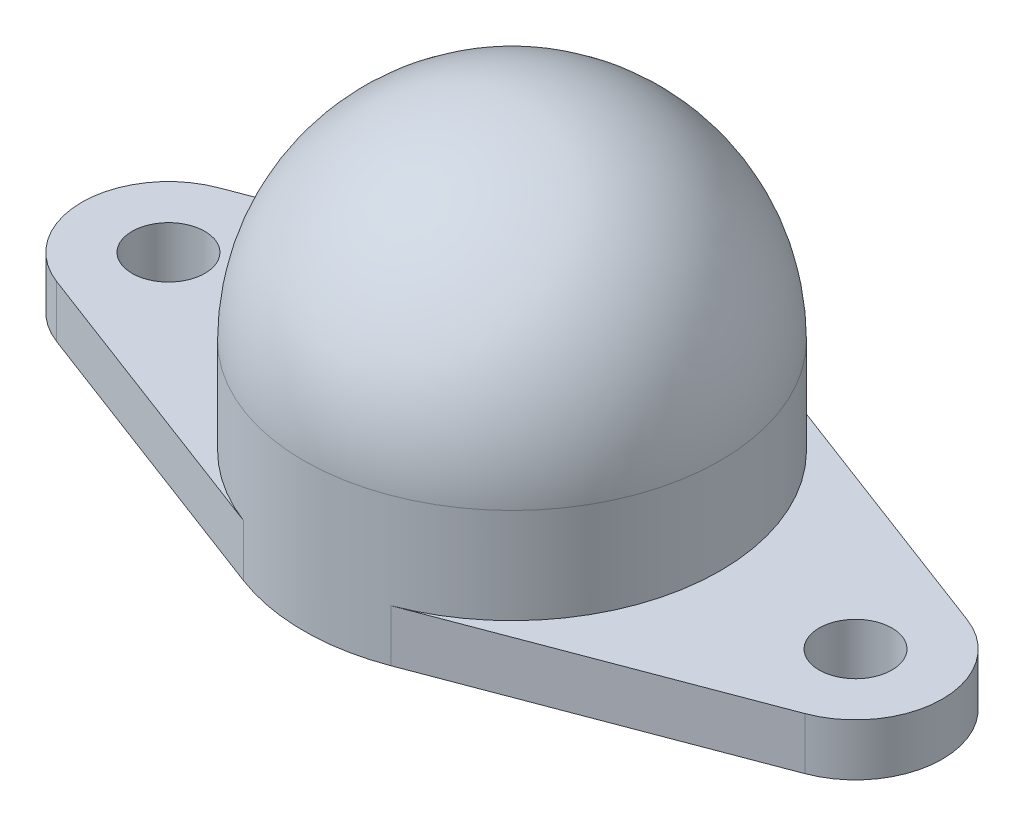
ISO-10303-21;
HEADER;
FILE_DESCRIPTION(('STEP AP214'),'2;1');
FILE_NAME('part.step','',(''),(''),'','','');
FILE_SCHEMA(('AUTOMOTIVE_DESIGN { 1 0 10303 214 1 1 1 1 }'));
ENDSEC;
DATA;
#1=APPLICATION_CONTEXT('core data for automotive mechanical design processes');
#2=APPLICATION_PROTOCOL_DEFINITION('international standard','automotive_design',2000,#1);
#3=PRODUCT_CONTEXT('',#1,'mechanical');
#4=PRODUCT('Part','Part','',(#3));
#5=PRODUCT_RELATED_PRODUCT_CATEGORY('part','',(#4));
#6=PRODUCT_DEFINITION_FORMATION('','',#4);
#7=PRODUCT_DEFINITION_CONTEXT('part definition',#1,'design');
#8=PRODUCT_DEFINITION('design','',#6,#7);
#9=PRODUCT_DEFINITION_SHAPE('','',#8);
#10=(LENGTH_UNIT() NAMED_UNIT(*) SI_UNIT(.MILLI.,.METRE.));
#11=(NAMED_UNIT(*) PLANE_ANGLE_UNIT() SI_UNIT($,.RADIAN.));
#12=(NAMED_UNIT(*) SI_UNIT($,.STERADIAN.) SOLID_ANGLE_UNIT());
#13=UNCERTAINTY_MEASURE_WITH_UNIT(LENGTH_MEASURE(1.E-05),#10,'distance_accuracy_value','');
#14=(GEOMETRIC_REPRESENTATION_CONTEXT(3) GLOBAL_UNCERTAINTY_ASSIGNED_CONTEXT((#13)) GLOBAL_UNIT_ASSIGNED_CONTEXT((#10,
#11,#12)) REPRESENTATION_CONTEXT('',''));
#15=CARTESIAN_POINT('',(0.,0.,0.));
#16=DIRECTION('',(0.,0.,1.));
#17=DIRECTION('',(1.,0.,0.));
#18=AXIS2_PLACEMENT_3D('',#15,#16,#17);
#19=CARTESIAN_POINT('',(0.,3.,0.));
#20=DIRECTION('',(0.,1.,0.));
#21=DIRECTION('',(0.,0.,1.));
#22=AXIS2_PLACEMENT_3D('',#19,#20,#21);
#23=PLANE('',#22);
#24=CARTESIAN_POINT('',(0.,3.,0.));
#25=DIRECTION('',(0.,1.,0.));
#26=DIRECTION('',(0.,0.,1.));
#27=AXIS2_PLACEMENT_3D('',#24,#25,#26);
#28=CIRCLE('',#27,12.);
#29=CARTESIAN_POINT('',(4.24242424242424,3.,11.225053966342));
#30=VERTEX_POINT('',#29);
#31=CARTESIAN_POINT('',(4.24242424242425,3.,-11.225053966342));
#32=VERTEX_POINT('',#31);
#33=EDGE_CURVE('E118',#30,#32,#28,.T.);
#34=ORIENTED_EDGE('',*,*,#33,.F.);
#35=DIRECTION('',(0.935421163861836,0.,-0.353535353535354));
#36=VECTOR('',#35,1.);
#37=CARTESIAN_POINT('',(21.5676767676768,3.,4.67710581930919));
#38=LINE('',#37,#36);
#39=CARTESIAN_POINT('',(21.5676767676768,3.,4.67710581930919));
#40=VERTEX_POINT('',#39);
#41=EDGE_CURVE('E112',#30,#40,#38,.T.);
#42=ORIENTED_EDGE('',*,*,#41,.T.);
#43=CARTESIAN_POINT('',(19.8,3.,0.));
#44=DIRECTION('',(0.,1.,0.));
#45=DIRECTION('',(0.,0.,-1.));
#46=AXIS2_PLACEMENT_3D('',#43,#44,#45);
#47=CIRCLE('',#46,5.);
#48=CARTESIAN_POINT('',(21.5676767676768,3.,-4.67710581930918));
#49=VERTEX_POINT('',#48);
#50=EDGE_CURVE('E116',#40,#49,#47,.T.);
#51=ORIENTED_EDGE('',*,*,#50,.T.);
#52=DIRECTION('',(-0.935421163861836,0.,-0.353535353535354));
#53=VECTOR('',#52,1.);
#54=CARTESIAN_POINT('',(21.5676767676768,3.,-4.67710581930918));
#55=LINE('',#54,#53);
#56=EDGE_CURVE('E57',#49,#32,#55,.T.);
#57=ORIENTED_EDGE('',*,*,#56,.T.);
#58=EDGE_LOOP('',(#34,#42,#51,#57));
#59=FACE_BOUND('',#58,.T.);
#60=CARTESIAN_POINT('',(19.8,3.,0.));
#61=DIRECTION('',(0.,1.,0.));
#62=DIRECTION('',(0.,0.,-1.));
#63=AXIS2_PLACEMENT_3D('',#60,#61,#62);
#64=CIRCLE('',#63,2.1);
#65=CARTESIAN_POINT('',(19.8,3.,-2.1));
#66=VERTEX_POINT('',#65);
#67=EDGE_CURVE('E195',#66,#66,#64,.T.);
#68=ORIENTED_EDGE('',*,*,#67,.F.);
#69=EDGE_LOOP('',(#68));
#70=FACE_BOUND('',#69,.T.);
#71=ADVANCED_FACE('F39',(#59,#70),#23,.T.);
#72=CARTESIAN_POINT('',(-4.24242424242425,3.,-11.225053966342));
#73=VERTEX_POINT('',#72);
#74=CARTESIAN_POINT('',(-4.24242424242424,3.,11.225053966342));
#75=VERTEX_POINT('',#74);
#76=EDGE_CURVE('E49',#73,#75,#28,.T.);
#77=ORIENTED_EDGE('',*,*,#76,.F.);
#78=DIRECTION('',(-0.935421163861836,0.,0.353535353535354));
#79=VECTOR('',#78,1.);
#80=CARTESIAN_POINT('',(-21.5676767676768,3.,-4.67710581930918));
#81=LINE('',#80,#79);
#82=CARTESIAN_POINT('',(-21.5676767676768,3.,-4.67710581930918));
#83=VERTEX_POINT('',#82);
#84=EDGE_CURVE('E164',#73,#83,#81,.T.);
#85=ORIENTED_EDGE('',*,*,#84,.T.);
#86=CARTESIAN_POINT('',(-19.8,3.,0.));
#87=DIRECTION('',(0.,1.,0.));
#88=DIRECTION('',(0.,0.,1.));
#89=AXIS2_PLACEMENT_3D('',#86,#87,#88);
#90=CIRCLE('',#89,5.);
#91=CARTESIAN_POINT('',(-21.5676767676768,3.,4.67710581930919));
#92=VERTEX_POINT('',#91);
#93=EDGE_CURVE('E211',#83,#92,#90,.T.);
#94=ORIENTED_EDGE('',*,*,#93,.T.);
#95=DIRECTION('',(0.935421163861836,0.,0.353535353535354));
#96=VECTOR('',#95,1.);
#97=CARTESIAN_POINT('',(-21.5676767676768,3.,4.67710581930919));
#98=LINE('',#97,#96);
#99=EDGE_CURVE('E123',#92,#75,#98,.T.);
#100=ORIENTED_EDGE('',*,*,#99,.T.);
#101=EDGE_LOOP('',(#77,#85,#94,#100));
#102=FACE_BOUND('',#101,.T.);
#103=CARTESIAN_POINT('',(-19.8,3.,0.));
#104=DIRECTION('',(0.,1.,0.));
#105=DIRECTION('',(0.,0.,1.));
#106=AXIS2_PLACEMENT_3D('',#103,#104,#105);
#107=CIRCLE('',#106,2.1);
#108=CARTESIAN_POINT('',(-19.8,3.,2.1));
#109=VERTEX_POINT('',#108);
#110=EDGE_CURVE('E146',#109,#109,#107,.T.);
#111=ORIENTED_EDGE('',*,*,#110,.F.);
#112=EDGE_LOOP('',(#111));
#113=FACE_BOUND('',#112,.T.);
#114=ADVANCED_FACE('F216',(#102,#113),#23,.T.);
#115=CARTESIAN_POINT('',(0.,0.,0.));
#116=DIRECTION('',(0.,1.,0.));
#117=DIRECTION('',(0.,0.,1.));
#118=AXIS2_PLACEMENT_3D('',#115,#116,#117);
#119=PLANE('',#118);
#120=CARTESIAN_POINT('',(0.,0.,0.));
#121=DIRECTION('',(0.,1.,0.));
#122=DIRECTION('',(0.,0.,1.));
#123=AXIS2_PLACEMENT_3D('',#120,#121,#122);
#124=CIRCLE('',#123,12.);
#125=CARTESIAN_POINT('',(4.24242424242425,0.,-11.225053966342));
#126=VERTEX_POINT('',#125);
#127=CARTESIAN_POINT('',(-4.24242424242425,0.,-11.225053966342));
#128=VERTEX_POINT('',#127);
#129=EDGE_CURVE('E141',#126,#128,#124,.T.);
#130=ORIENTED_EDGE('',*,*,#129,.F.);
#131=DIRECTION('',(-0.935421163861836,0.,-0.353535353535354));
#132=VECTOR('',#131,1.);
#133=CARTESIAN_POINT('',(21.5676767676768,0.,-4.67710581930918));
#134=LINE('',#133,#132);
#135=CARTESIAN_POINT('',(21.5676767676768,0.,-4.67710581930918));
#136=VERTEX_POINT('',#135);
#137=EDGE_CURVE('E93',#136,#126,#134,.T.);
#138=ORIENTED_EDGE('',*,*,#137,.F.);
#139=CARTESIAN_POINT('',(19.8,0.,0.));
#140=DIRECTION('',(0.,1.,0.));
#141=DIRECTION('',(0.,0.,-1.));
#142=AXIS2_PLACEMENT_3D('',#139,#140,#141);
#143=CIRCLE('',#142,5.);
#144=CARTESIAN_POINT('',(21.5676767676768,0.,4.67710581930919));
#145=VERTEX_POINT('',#144);
#146=EDGE_CURVE('E87',#145,#136,#143,.T.);
#147=ORIENTED_EDGE('',*,*,#146,.F.);
#148=DIRECTION('',(0.935421163861836,0.,-0.353535353535354));
#149=VECTOR('',#148,1.);
#150=CARTESIAN_POINT('',(21.5676767676768,0.,4.67710581930919));
#151=LINE('',#150,#149);
#152=CARTESIAN_POINT('',(4.24242424242424,0.,11.225053966342));
#153=VERTEX_POINT('',#152);
#154=EDGE_CURVE('E128',#153,#145,#151,.T.);
#155=ORIENTED_EDGE('',*,*,#154,.F.);
#156=CARTESIAN_POINT('',(0.,0.,0.));
#157=DIRECTION('',(0.,1.,0.));
#158=DIRECTION('',(0.,0.,1.));
#159=AXIS2_PLACEMENT_3D('',#156,#157,#158);
#160=CIRCLE('',#159,12.);
#161=CARTESIAN_POINT('',(-4.24242424242424,0.,11.225053966342));
#162=VERTEX_POINT('',#161);
#163=EDGE_CURVE('E155',#162,#153,#160,.T.);
#164=ORIENTED_EDGE('',*,*,#163,.F.);
#165=DIRECTION('',(0.935421163861836,0.,0.353535353535354));
#166=VECTOR('',#165,1.);
#167=CARTESIAN_POINT('',(-21.5676767676768,0.,4.67710581930919));
#168=LINE('',#167,#166);
#169=CARTESIAN_POINT('',(-21.5676767676768,0.,4.67710581930919));
#170=VERTEX_POINT('',#169);
#171=EDGE_CURVE('E152',#170,#162,#168,.T.);
#172=ORIENTED_EDGE('',*,*,#171,.F.);
#173=CARTESIAN_POINT('',(-19.8,0.,0.));
#174=DIRECTION('',(0.,1.,0.));
#175=DIRECTION('',(0.,0.,1.));
#176=AXIS2_PLACEMENT_3D('',#173,#174,#175);
#177=CIRCLE('',#176,5.);
#178=CARTESIAN_POINT('',(-21.5676767676768,0.,-4.67710581930918));
#179=VERTEX_POINT('',#178);
#180=EDGE_CURVE('E149',#179,#170,#177,.T.);
#181=ORIENTED_EDGE('',*,*,#180,.F.);
#182=DIRECTION('',(-0.935421163861836,0.,0.353535353535354));
#183=VECTOR('',#182,1.);
#184=CARTESIAN_POINT('',(-21.5676767676768,0.,-4.67710581930918));
#185=LINE('',#184,#183);
#186=EDGE_CURVE('E145',#128,#179,#185,.T.);
#187=ORIENTED_EDGE('',*,*,#186,.F.);
#188=EDGE_LOOP('',(#130,#138,#147,#155,#164,#172,#181,#187));
#189=FACE_BOUND('',#188,.T.);
#190=CARTESIAN_POINT('',(-19.8,0.,0.));
#191=DIRECTION('',(0.,1.,0.));
#192=DIRECTION('',(0.,0.,1.));
#193=AXIS2_PLACEMENT_3D('',#190,#191,#192);
#194=CIRCLE('',#193,2.1);
#195=CARTESIAN_POINT('',(-19.8,0.,2.1));
#196=VERTEX_POINT('',#195);
#197=EDGE_CURVE('E201',#196,#196,#194,.T.);
#198=ORIENTED_EDGE('',*,*,#197,.T.);
#199=EDGE_LOOP('',(#198));
#200=FACE_BOUND('',#199,.T.);
#201=CARTESIAN_POINT('',(19.8,0.,0.));
#202=DIRECTION('',(0.,1.,0.));
#203=DIRECTION('',(0.,0.,-1.));
#204=AXIS2_PLACEMENT_3D('',#201,#202,#203);
#205=CIRCLE('',#204,2.1);
#206=CARTESIAN_POINT('',(19.8,0.,-2.1));
#207=VERTEX_POINT('',#206);
#208=EDGE_CURVE('E192',#207,#207,#205,.T.);
#209=ORIENTED_EDGE('',*,*,#208,.T.);
#210=EDGE_LOOP('',(#209));
#211=FACE_BOUND('',#210,.T.);
#212=ADVANCED_FACE('F227',(#189,#200,#211),#119,.F.);
#213=CARTESIAN_POINT('',(-21.5676767676768,3.,-4.67710581930918));
#214=DIRECTION('',(0.353535353535354,0.,0.935421163861836));
#215=DIRECTION('',(0.935421163861836,0.,-0.353535353535354));
#216=AXIS2_PLACEMENT_3D('',#213,#214,#215);
#217=PLANE('',#216);
#218=ORIENTED_EDGE('',*,*,#186,.T.);
#219=DIRECTION('',(0.,-1.,0.));
#220=VECTOR('',#219,1.);
#221=CARTESIAN_POINT('',(-21.5676767676768,3.,-4.67710581930918));
#222=LINE('',#221,#220);
#223=EDGE_CURVE('E179',#83,#179,#222,.T.);
#224=ORIENTED_EDGE('',*,*,#223,.F.);
#225=ORIENTED_EDGE('',*,*,#84,.F.);
#226=DIRECTION('',(0.,-1.,0.));
#227=VECTOR('',#226,1.);
#228=CARTESIAN_POINT('',(-4.24242424242425,3.,-11.225053966342));
#229=LINE('',#228,#227);
#230=EDGE_CURVE('E182',#73,#128,#229,.T.);
#231=ORIENTED_EDGE('',*,*,#230,.T.);
#232=EDGE_LOOP('',(#218,#224,#225,#231));
#233=FACE_BOUND('',#232,.T.);
#234=ADVANCED_FACE('F250',(#233),#217,.F.);
#235=CARTESIAN_POINT('',(-19.8,3.,0.));
#236=DIRECTION('',(0.,-1.,0.));
#237=DIRECTION('',(0.,0.,-1.));
#238=AXIS2_PLACEMENT_3D('',#235,#236,#237);
#239=CYLINDRICAL_SURFACE('',#238,5.);
#240=ORIENTED_EDGE('',*,*,#180,.T.);
#241=DIRECTION('',(0.,-1.,0.));
#242=VECTOR('',#241,1.);
#243=CARTESIAN_POINT('',(-21.5676767676768,3.,4.67710581930919));
#244=LINE('',#243,#242);
#245=EDGE_CURVE('E175',#92,#170,#244,.T.);
#246=ORIENTED_EDGE('',*,*,#245,.F.);
#247=ORIENTED_EDGE('',*,*,#93,.F.);
#248=ORIENTED_EDGE('',*,*,#223,.T.);
#249=EDGE_LOOP('',(#240,#246,#247,#248));
#250=FACE_BOUND('',#249,.T.);
#251=ADVANCED_FACE('F254',(#250),#239,.T.);
#252=CARTESIAN_POINT('',(-21.5676767676768,3.,4.67710581930919));
#253=DIRECTION('',(0.353535353535354,0.,-0.935421163861836));
#254=DIRECTION('',(-0.935421163861836,0.,-0.353535353535354));
#255=AXIS2_PLACEMENT_3D('',#252,#253,#254);
#256=PLANE('',#255);
#257=ORIENTED_EDGE('',*,*,#171,.T.);
#258=DIRECTION('',(0.,-1.,0.));
#259=VECTOR('',#258,1.);
#260=CARTESIAN_POINT('',(-4.24242424242424,3.,11.225053966342));
#261=LINE('',#260,#259);
#262=EDGE_CURVE('E171',#75,#162,#261,.T.);
#263=ORIENTED_EDGE('',*,*,#262,.F.);
#264=ORIENTED_EDGE('',*,*,#99,.F.);
#265=ORIENTED_EDGE('',*,*,#245,.T.);
#266=EDGE_LOOP('',(#257,#263,#264,#265));
#267=FACE_BOUND('',#266,.T.);
#268=ADVANCED_FACE('F221',(#267),#256,.F.);
#269=CARTESIAN_POINT('',(0.,3.,0.));
#270=DIRECTION('',(0.,-1.,0.));
#271=DIRECTION('',(0.,0.,-1.));
#272=AXIS2_PLACEMENT_3D('',#269,#270,#271);
#273=CYLINDRICAL_SURFACE('',#272,12.);
#274=CARTESIAN_POINT('',(0.,8.5,0.));
#275=DIRECTION('',(0.,-1.,0.));
#276=DIRECTION('',(0.,0.,-1.));
#277=AXIS2_PLACEMENT_3D('',#274,#275,#276);
#278=CIRCLE('',#277,12.);
#279=CARTESIAN_POINT('',(0.,8.5,-12.));
#280=VERTEX_POINT('',#279);
#281=EDGE_CURVE('E11',#280,#280,#278,.T.);
#282=ORIENTED_EDGE('',*,*,#281,.T.);
#283=EDGE_LOOP('',(#282));
#284=FACE_BOUND('',#283,.T.);
#285=ORIENTED_EDGE('',*,*,#163,.T.);
#286=DIRECTION('',(0.,-1.,0.));
#287=VECTOR('',#286,1.);
#288=CARTESIAN_POINT('',(4.24242424242424,3.,11.225053966342));
#289=LINE('',#288,#287);
#290=EDGE_CURVE('E130',#30,#153,#289,.T.);
#291=ORIENTED_EDGE('',*,*,#290,.F.);
#292=ORIENTED_EDGE('',*,*,#33,.T.);
#293=DIRECTION('',(0.,-1.,0.));
#294=VECTOR('',#293,1.);
#295=CARTESIAN_POINT('',(4.24242424242425,3.,-11.225053966342));
#296=LINE('',#295,#294);
#297=EDGE_CURVE('E137',#32,#126,#296,.T.);
#298=ORIENTED_EDGE('',*,*,#297,.T.);
#299=ORIENTED_EDGE('',*,*,#129,.T.);
#300=ORIENTED_EDGE('',*,*,#230,.F.);
#301=ORIENTED_EDGE('',*,*,#76,.T.);
#302=ORIENTED_EDGE('',*,*,#262,.T.);
#303=EDGE_LOOP('',(#285,#291,#292,#298,#299,#300,#301,#302));
#304=FACE_BOUND('',#303,.T.);
#305=ADVANCED_FACE('F224',(#284,#304),#273,.T.);
#306=CARTESIAN_POINT('',(21.5676767676768,3.,4.67710581930919));
#307=DIRECTION('',(-0.353535353535354,0.,-0.935421163861836));
#308=DIRECTION('',(-0.935421163861836,0.,0.353535353535354));
#309=AXIS2_PLACEMENT_3D('',#306,#307,#308);
#310=PLANE('',#309);
#311=ORIENTED_EDGE('',*,*,#154,.T.);
#312=DIRECTION('',(0.,-1.,0.));
#313=VECTOR('',#312,1.);
#314=CARTESIAN_POINT('',(21.5676767676768,3.,4.67710581930919));
#315=LINE('',#314,#313);
#316=EDGE_CURVE('E125',#40,#145,#315,.T.);
#317=ORIENTED_EDGE('',*,*,#316,.F.);
#318=ORIENTED_EDGE('',*,*,#41,.F.);
#319=ORIENTED_EDGE('',*,*,#290,.T.);
#320=EDGE_LOOP('',(#311,#317,#318,#319));
#321=FACE_BOUND('',#320,.T.);
#322=ADVANCED_FACE('F126',(#321),#310,.F.);
#323=CARTESIAN_POINT('',(19.8,3.,0.));
#324=DIRECTION('',(0.,-1.,0.));
#325=DIRECTION('',(0.,0.,-1.));
#326=AXIS2_PLACEMENT_3D('',#323,#324,#325);
#327=CYLINDRICAL_SURFACE('',#326,5.);
#328=ORIENTED_EDGE('',*,*,#146,.T.);
#329=DIRECTION('',(0.,-1.,0.));
#330=VECTOR('',#329,1.);
#331=CARTESIAN_POINT('',(21.5676767676768,3.,-4.67710581930918));
#332=LINE('',#331,#330);
#333=EDGE_CURVE('E131',#49,#136,#332,.T.);
#334=ORIENTED_EDGE('',*,*,#333,.F.);
#335=ORIENTED_EDGE('',*,*,#50,.F.);
#336=ORIENTED_EDGE('',*,*,#316,.T.);
#337=EDGE_LOOP('',(#328,#334,#335,#336));
#338=FACE_BOUND('',#337,.T.);
#339=ADVANCED_FACE('F133',(#338),#327,.T.);
#340=CARTESIAN_POINT('',(21.5676767676768,3.,-4.67710581930918));
#341=DIRECTION('',(-0.353535353535354,0.,0.935421163861836));
#342=DIRECTION('',(0.935421163861836,0.,0.353535353535354));
#343=AXIS2_PLACEMENT_3D('',#340,#341,#342);
#344=PLANE('',#343);
#345=ORIENTED_EDGE('',*,*,#137,.T.);
#346=ORIENTED_EDGE('',*,*,#297,.F.);
#347=ORIENTED_EDGE('',*,*,#56,.F.);
#348=ORIENTED_EDGE('',*,*,#333,.T.);
#349=EDGE_LOOP('',(#345,#346,#347,#348));
#350=FACE_BOUND('',#349,.T.);
#351=ADVANCED_FACE('F230',(#350),#344,.F.);
#352=CARTESIAN_POINT('',(-19.8,3.,0.));
#353=DIRECTION('',(0.,-1.,0.));
#354=DIRECTION('',(0.,0.,-1.));
#355=AXIS2_PLACEMENT_3D('',#352,#353,#354);
#356=CYLINDRICAL_SURFACE('',#355,2.1);
#357=ORIENTED_EDGE('',*,*,#110,.T.);
#358=EDGE_LOOP('',(#357));
#359=FACE_BOUND('',#358,.T.);
#360=ORIENTED_EDGE('',*,*,#197,.F.);
#361=EDGE_LOOP('',(#360));
#362=FACE_BOUND('',#361,.T.);
#363=ADVANCED_FACE('F232',(#359,#362),#356,.F.);
#364=CARTESIAN_POINT('',(19.8,3.,0.));
#365=DIRECTION('',(0.,-1.,0.));
#366=DIRECTION('',(0.,0.,-1.));
#367=AXIS2_PLACEMENT_3D('',#364,#365,#366);
#368=CYLINDRICAL_SURFACE('',#367,2.1);
#369=ORIENTED_EDGE('',*,*,#67,.T.);
#370=EDGE_LOOP('',(#369));
#371=FACE_BOUND('',#370,.T.);
#372=ORIENTED_EDGE('',*,*,#208,.F.);
#373=EDGE_LOOP('',(#372));
#374=FACE_BOUND('',#373,.T.);
#375=ADVANCED_FACE('F238',(#371,#374),#368,.F.);
#376=CARTESIAN_POINT('',(0.,8.5,0.));
#377=DIRECTION('',(0.,1.,0.));
#378=DIRECTION('',(0.,0.,1.));
#379=AXIS2_PLACEMENT_3D('',#376,#377,#378);
#380=SPHERICAL_SURFACE('',#379,12.);
#381=ORIENTED_EDGE('',*,*,#281,.F.);
#382=EDGE_LOOP('',(#381));
#383=FACE_BOUND('',#382,.T.);
#384=ADVANCED_FACE('F41',(#383),#380,.T.);
#385=CLOSED_SHELL('',(#71,#114,#212,#234,#251,#268,#305,#322,#339,#351,#363,#375,#384));
#386=MANIFOLD_SOLID_BREP('B2',#385);
#387=ADVANCED_BREP_SHAPE_REPRESENTATION('',(#18,#386),#14);
#388=SHAPE_DEFINITION_REPRESENTATION(#9,#387);
ENDSEC;
END-ISO-10303-21;
